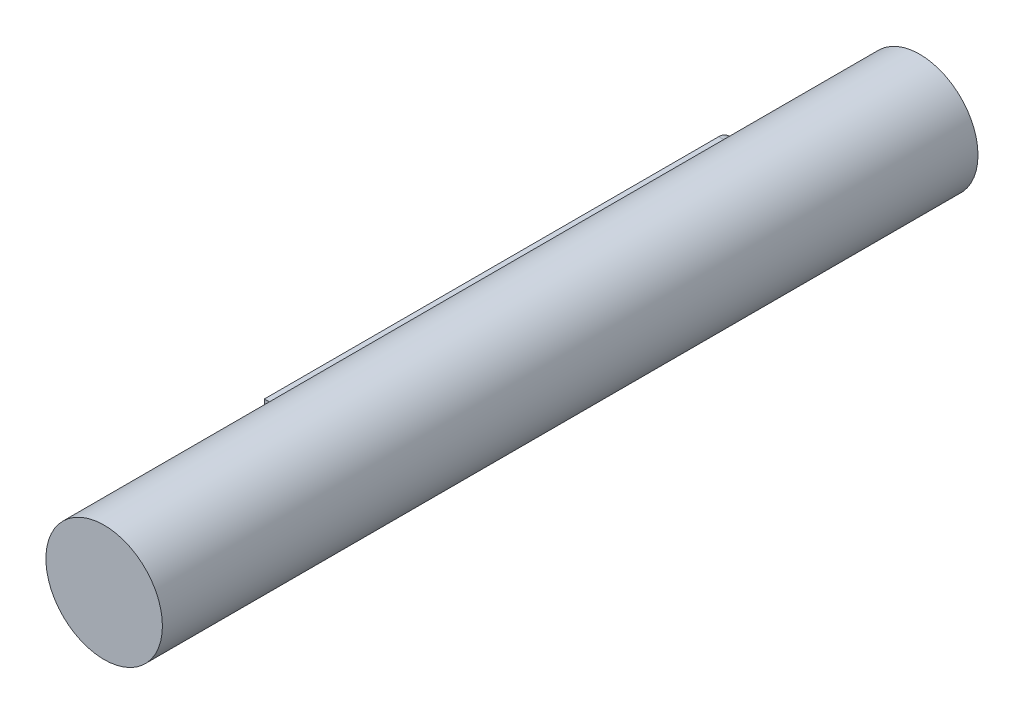
ISO-10303-21;
HEADER;
FILE_DESCRIPTION(('STEP AP214'),'2;1');
FILE_NAME('part.step','',(''),(''),'','','');
FILE_SCHEMA(('AUTOMOTIVE_DESIGN { 1 0 10303 214 1 1 1 1 }'));
ENDSEC;
DATA;
#1=APPLICATION_CONTEXT('core data for automotive mechanical design processes');
#2=APPLICATION_PROTOCOL_DEFINITION('international standard','automotive_design',2000,#1);
#3=PRODUCT_CONTEXT('',#1,'mechanical');
#4=PRODUCT('Part','Part','',(#3));
#5=PRODUCT_RELATED_PRODUCT_CATEGORY('part','',(#4));
#6=PRODUCT_DEFINITION_FORMATION('','',#4);
#7=PRODUCT_DEFINITION_CONTEXT('part definition',#1,'design');
#8=PRODUCT_DEFINITION('design','',#6,#7);
#9=PRODUCT_DEFINITION_SHAPE('','',#8);
#10=(LENGTH_UNIT() NAMED_UNIT(*) SI_UNIT(.MILLI.,.METRE.));
#11=(NAMED_UNIT(*) PLANE_ANGLE_UNIT() SI_UNIT($,.RADIAN.));
#12=(NAMED_UNIT(*) SI_UNIT($,.STERADIAN.) SOLID_ANGLE_UNIT());
#13=UNCERTAINTY_MEASURE_WITH_UNIT(LENGTH_MEASURE(1.E-05),#10,'distance_accuracy_value','');
#14=(GEOMETRIC_REPRESENTATION_CONTEXT(3) GLOBAL_UNCERTAINTY_ASSIGNED_CONTEXT((#13)) GLOBAL_UNIT_ASSIGNED_CONTEXT((#10,
#11,#12)) REPRESENTATION_CONTEXT('',''));
#15=CARTESIAN_POINT('',(0.,0.,0.));
#16=DIRECTION('',(0.,0.,1.));
#17=DIRECTION('',(1.,0.,0.));
#18=AXIS2_PLACEMENT_3D('',#15,#16,#17);
#19=CARTESIAN_POINT('',(-12.5,-2.5,140.));
#20=DIRECTION('',(0.,1.,0.));
#21=DIRECTION('',(-1.,0.,0.));
#22=AXIS2_PLACEMENT_3D('',#19,#20,#21);
#23=PLANE('',#22);
#24=DIRECTION('',(0.,0.,-1.));
#25=VECTOR('',#24,1.);
#26=CARTESIAN_POINT('',(-12.5,-2.5,140.));
#27=LINE('',#26,#25);
#28=CARTESIAN_POINT('',(-12.5,-2.5,100.));
#29=VERTEX_POINT('',#28);
#30=CARTESIAN_POINT('',(-12.5,-2.5,22.0001));
#31=VERTEX_POINT('',#30);
#32=EDGE_CURVE('E129',#29,#31,#27,.T.);
#33=ORIENTED_EDGE('',*,*,#32,.T.);
#34=CARTESIAN_POINT('',(-9.54158128379447,-2.5,22.0001));
#35=CARTESIAN_POINT('',(-9.86105418919632,-2.5,22.0001));
#36=CARTESIAN_POINT('',(-10.1805270945982,-2.5,22.0001));
#37=CARTESIAN_POINT('',(-11.213625693908,-2.5,22.0001));
#38=CARTESIAN_POINT('',(-11.927251387816,-2.5,22.0001));
#39=CARTESIAN_POINT('',(-12.6408770817241,-2.5,22.0001));
#40=(BOUNDED_CURVE() B_SPLINE_CURVE(3,(#34,#35,#36,#37,#38,#39),.UNSPECIFIED.,.F.,
.F.) B_SPLINE_CURVE_WITH_KNOTS((4,2,4),(-0.0126408770817244,-0.0116824583655189,
-0.00954158128379478),
.UNSPECIFIED.) CURVE() GEOMETRIC_REPRESENTATION_ITEM() RATIONAL_B_SPLINE_CURVE((1.,1.,1.,1.,1.,1.)) REPRESENTATION_ITEM(''));
#41=CARTESIAN_POINT('',(-9.68245836551855,-2.5,22.0001));
#42=VERTEX_POINT('',#41);
#43=EDGE_CURVE('E236',#31,#42,#40,.F.);
#44=ORIENTED_EDGE('',*,*,#43,.T.);
#45=DIRECTION('',(0.,0.,-1.));
#46=VECTOR('',#45,1.);
#47=CARTESIAN_POINT('',(-9.68245836551855,-2.5,140.));
#48=LINE('',#47,#46);
#49=CARTESIAN_POINT('',(-9.68245836551855,-2.5,100.));
#50=VERTEX_POINT('',#49);
#51=EDGE_CURVE('E132',#50,#42,#48,.T.);
#52=ORIENTED_EDGE('',*,*,#51,.F.);
#53=DIRECTION('',(1.,0.,0.));
#54=VECTOR('',#53,1.);
#55=CARTESIAN_POINT('',(-9.68245836551855,-2.5,100.));
#56=LINE('',#55,#54);
#57=EDGE_CURVE('E118',#29,#50,#56,.T.);
#58=ORIENTED_EDGE('',*,*,#57,.F.);
#59=EDGE_LOOP('',(#33,#44,#52,#58));
#60=FACE_BOUND('',#59,.T.);
#61=ADVANCED_FACE('F53',(#60),#23,.F.);
#62=CARTESIAN_POINT('',(-12.5,2.5,140.));
#63=DIRECTION('',(0.,-1.,0.));
#64=DIRECTION('',(0.,0.,-1.));
#65=AXIS2_PLACEMENT_3D('',#62,#63,#64);
#66=PLANE('',#65);
#67=DIRECTION('',(0.,0.,-1.));
#68=VECTOR('',#67,1.);
#69=CARTESIAN_POINT('',(-9.68245836551854,2.5,140.));
#70=LINE('',#69,#68);
#71=CARTESIAN_POINT('',(-9.68245836551855,2.5,100.));
#72=VERTEX_POINT('',#71);
#73=CARTESIAN_POINT('',(-9.68245836551854,2.5,22.0001));
#74=VERTEX_POINT('',#73);
#75=EDGE_CURVE('E146',#72,#74,#70,.T.);
#76=ORIENTED_EDGE('',*,*,#75,.T.);
#77=CARTESIAN_POINT('',(-12.6408770817241,2.5,22.0001));
#78=CARTESIAN_POINT('',(-11.927251387816,2.5,22.0001));
#79=CARTESIAN_POINT('',(-11.213625693908,2.5,22.0001));
#80=CARTESIAN_POINT('',(-10.1805270945982,2.5,22.0001));
#81=CARTESIAN_POINT('',(-9.86105418919631,2.5,22.0001));
#82=CARTESIAN_POINT('',(-9.54158128379447,2.5,22.0001));
#83=(BOUNDED_CURVE() B_SPLINE_CURVE(3,(#77,#78,#79,#80,#81,#82),.UNSPECIFIED.,.F.,
.F.) B_SPLINE_CURVE_WITH_KNOTS((4,2,4),(0.00954158128379479,0.0116824583655189,
0.0126408770817244),
.UNSPECIFIED.) CURVE() GEOMETRIC_REPRESENTATION_ITEM() RATIONAL_B_SPLINE_CURVE((1.,1.,1.,1.,1.,1.)) REPRESENTATION_ITEM(''));
#84=CARTESIAN_POINT('',(-12.5,2.5,22.0001));
#85=VERTEX_POINT('',#84);
#86=EDGE_CURVE('E80',#74,#85,#83,.F.);
#87=ORIENTED_EDGE('',*,*,#86,.T.);
#88=DIRECTION('',(0.,0.,-1.));
#89=VECTOR('',#88,1.);
#90=CARTESIAN_POINT('',(-12.5,2.5,140.));
#91=LINE('',#90,#89);
#92=CARTESIAN_POINT('',(-12.5,2.5,100.));
#93=VERTEX_POINT('',#92);
#94=EDGE_CURVE('E141',#93,#85,#91,.T.);
#95=ORIENTED_EDGE('',*,*,#94,.F.);
#96=DIRECTION('',(-1.,0.,0.));
#97=VECTOR('',#96,1.);
#98=CARTESIAN_POINT('',(-9.68245836551855,2.5,100.));
#99=LINE('',#98,#97);
#100=EDGE_CURVE('E121',#72,#93,#99,.T.);
#101=ORIENTED_EDGE('',*,*,#100,.F.);
#102=EDGE_LOOP('',(#76,#87,#95,#101));
#103=FACE_BOUND('',#102,.T.);
#104=ADVANCED_FACE('F173',(#103),#66,.F.);
#105=CARTESIAN_POINT('',(-12.5,-2.5,140.));
#106=DIRECTION('',(1.,0.,0.));
#107=DIRECTION('',(0.,0.,-1.));
#108=AXIS2_PLACEMENT_3D('',#105,#106,#107);
#109=PLANE('',#108);
#110=ORIENTED_EDGE('',*,*,#94,.T.);
#111=CARTESIAN_POINT('',(-12.5,-2.75,22.0001));
#112=CARTESIAN_POINT('',(-12.5,-2.,22.0001));
#113=CARTESIAN_POINT('',(-12.5,-1.25,22.0001));
#114=CARTESIAN_POINT('',(-12.5,-0.166666666666665,22.0001));
#115=CARTESIAN_POINT('',(-12.5,0.166666666666668,22.0001));
#116=CARTESIAN_POINT('',(-12.5,1.25,22.0001));
#117=CARTESIAN_POINT('',(-12.5,2.,22.0001));
#118=CARTESIAN_POINT('',(-12.5,2.75,22.0001));
#119=(BOUNDED_CURVE() B_SPLINE_CURVE(3,(#111,#112,#113,#114,#115,#116,#117,#118),.UNSPECIFIED.,
.F.,.F.) B_SPLINE_CURVE_WITH_KNOTS((4,2,2,4),(-0.00275,-0.0005,0.000499999999999999,0.00275),
.UNSPECIFIED.) CURVE() GEOMETRIC_REPRESENTATION_ITEM() RATIONAL_B_SPLINE_CURVE((1.,1.,1.,1.,1.,
1.,1.,1.)) REPRESENTATION_ITEM(''));
#120=EDGE_CURVE('E138',#85,#31,#119,.F.);
#121=ORIENTED_EDGE('',*,*,#120,.T.);
#122=ORIENTED_EDGE('',*,*,#32,.F.);
#123=DIRECTION('',(0.,-1.,0.));
#124=VECTOR('',#123,1.);
#125=CARTESIAN_POINT('',(-12.5,2.5,100.));
#126=LINE('',#125,#124);
#127=EDGE_CURVE('E115',#93,#29,#126,.T.);
#128=ORIENTED_EDGE('',*,*,#127,.F.);
#129=EDGE_LOOP('',(#110,#121,#122,#128));
#130=FACE_BOUND('',#129,.T.);
#131=ADVANCED_FACE('F136',(#130),#109,.F.);
#132=CARTESIAN_POINT('',(0.,0.,140.));
#133=DIRECTION('',(0.,0.,-1.));
#134=DIRECTION('',(-1.,0.,0.));
#135=AXIS2_PLACEMENT_3D('',#132,#133,#134);
#136=CYLINDRICAL_SURFACE('',#135,10.);
#137=ORIENTED_EDGE('',*,*,#75,.F.);
#138=CARTESIAN_POINT('',(0.,0.,100.));
#139=DIRECTION('',(0.,0.,-1.));
#140=DIRECTION('',(1.,0.,0.));
#141=AXIS2_PLACEMENT_3D('',#138,#139,#140);
#142=CIRCLE('',#141,10.);
#143=EDGE_CURVE('E134',#50,#72,#142,.T.);
#144=ORIENTED_EDGE('',*,*,#143,.F.);
#145=ORIENTED_EDGE('',*,*,#51,.T.);
#146=CARTESIAN_POINT('',(-9.9874921777191,-0.499999999999999,20.0001));
#147=CARTESIAN_POINT('',(-9.98492357502207,-0.551183505955471,20.0001056410229));
#148=CARTESIAN_POINT('',(-9.98193356320358,-0.602362675127145,20.001083027323));
#149=CARTESIAN_POINT('',(-9.97503529637868,-0.706579947574355,20.0053240990309));
#150=CARTESIAN_POINT('',(-9.97109566077099,-0.759612339914603,20.0086758409831));
#151=CARTESIAN_POINT('',(-9.96454582956608,-0.839567472977696,20.0157654567261));
#152=CARTESIAN_POINT('',(-9.96222502745392,-0.866602789285128,20.0185167596407));
#153=CARTESIAN_POINT('',(-9.95734895790728,-0.920934242525226,20.0248081867703));
#154=CARTESIAN_POINT('',(-9.9547909465647,-0.948228968998694,20.0283584652716));
#155=CARTESIAN_POINT('',(-9.94944037954686,-1.00300581598472,20.0363212762163));
#156=CARTESIAN_POINT('',(-9.94664538718713,-1.03048628032519,20.0407436018855));
#157=CARTESIAN_POINT('',(-9.94082068277931,-1.08555930960506,20.0505269818495));
#158=CARTESIAN_POINT('',(-9.93778879578896,-1.11314997253359,20.0558974943934));
#159=CARTESIAN_POINT('',(-9.93148917501651,-1.16836507372058,20.0676559700844));
#160=CARTESIAN_POINT('',(-9.9282194714646,-1.19598733492754,20.0740531289791));
#161=CARTESIAN_POINT('',(-9.92144728694388,-1.25118639233286,20.0879465868891));
#162=CARTESIAN_POINT('',(-9.91794302676574,-1.27876069767844,20.0954519728144));
#163=CARTESIAN_POINT('',(-9.91173226145924,-1.32586429133197,20.1093154085953));
#164=CARTESIAN_POINT('',(-9.90907781056222,-1.34547996433546,20.1154044761895));
#165=CARTESIAN_POINT('',(-9.90323575891121,-1.38770748895587,20.1292315621051));
#166=CARTESIAN_POINT('',(-9.90003218644179,-1.41028241041613,20.1370761636331));
#167=CARTESIAN_POINT('',(-9.89309172625997,-1.45811642255427,20.1547219504185));
#168=CARTESIAN_POINT('',(-9.88934099302549,-1.48332885051111,20.1646444169374));
#169=CARTESIAN_POINT('',(-9.88130300199088,-1.53608058804625,20.1868064969104));
#170=CARTESIAN_POINT('',(-9.8770029436917,-1.56356161718994,20.1991812315791));
#171=CARTESIAN_POINT('',(-9.870309261534,-1.60523599690796,20.2193120536524));
#172=CARTESIAN_POINT('',(-9.86795533764746,-1.619687064027,20.2265519040296));
#173=CARTESIAN_POINT('',(-9.86310964548691,-1.64900286682381,20.2417878236754));
#174=CARTESIAN_POINT('',(-9.86061640844938,-1.66385734592626,20.2498032141109));
#175=CARTESIAN_POINT('',(-9.85546629409651,-1.69413144878273,20.266768425334));
#176=CARTESIAN_POINT('',(-9.8528081250332,-1.70953563217538,20.275745453049));
#177=CARTESIAN_POINT('',(-9.84763760042937,-1.73913008905865,20.2936858072299));
#178=CARTESIAN_POINT('',(-9.84512581287481,-1.75333865518725,20.3026192063198));
#179=CARTESIAN_POINT('',(-9.83802637859361,-1.79300494742153,20.3284925647517));
#180=CARTESIAN_POINT('',(-9.83342952061639,-1.81810915721673,20.3459778583146));
#181=CARTESIAN_POINT('',(-9.82481402287985,-1.86412408047478,20.3802249494684));
#182=CARTESIAN_POINT('',(-9.82079441621375,-1.88516860108071,20.3968072796872));
#183=CARTESIAN_POINT('',(-9.81333469041476,-1.92350017428522,20.4287960970897));
#184=CARTESIAN_POINT('',(-9.8098901282229,-1.94090892422563,20.4440556584759));
#185=CARTESIAN_POINT('',(-9.80358752709996,-1.97234753976742,20.4730051842871));
#186=CARTESIAN_POINT('',(-9.80072068476531,-1.98648559810226,20.4865760939837));
#187=CARTESIAN_POINT('',(-9.79372940651825,-2.02069817433312,20.5208124256131));
#188=CARTESIAN_POINT('',(-9.78964645133872,-2.04044349561703,20.541817352336));
#189=CARTESIAN_POINT('',(-9.78172305112722,-2.0782566151617,20.5845794960078));
#190=CARTESIAN_POINT('',(-9.77787941165725,-2.09634981466548,20.6063137111583));
#191=CARTESIAN_POINT('',(-9.77043861587688,-2.13094672512372,20.6504475702414));
#192=CARTESIAN_POINT('',(-9.76683837984376,-2.14747223114814,20.6728296168054));
#193=CARTESIAN_POINT('',(-9.7598830492511,-2.17901728127967,20.7181734336649));
#194=CARTESIAN_POINT('',(-9.75652513634276,-2.19405533891931,20.7411219098127));
#195=CARTESIAN_POINT('',(-9.75005442960086,-2.22270741140073,20.7875164558557));
#196=CARTESIAN_POINT('',(-9.74693906645117,-2.23633707241771,20.8109525191282));
#197=CARTESIAN_POINT('',(-9.74095310279163,-2.26225172972008,20.8582428669223));
#198=CARTESIAN_POINT('',(-9.73808016352248,-2.27455000652955,20.8820895909216));
#199=CARTESIAN_POINT('',(-9.73257876148505,-2.29787888529219,20.9301246249363));
#200=CARTESIAN_POINT('',(-9.72994814453865,-2.30892091617732,20.9543071488201));
#201=CARTESIAN_POINT('',(-9.72493134597715,-2.32981185866372,21.0029396819767));
#202=CARTESIAN_POINT('',(-9.72254313422412,-2.33967083250647,21.0273851690662));
#203=CARTESIAN_POINT('',(-9.7180103907684,-2.35826781207661,21.0764718160761));
#204=CARTESIAN_POINT('',(-9.71586389514456,-2.3670149398938,21.1011093470959));
#205=CARTESIAN_POINT('',(-9.71181679555187,-2.38345813795292,21.1505107617006));
#206=CARTESIAN_POINT('',(-9.70991420258953,-2.39116274293037,21.175271648617));
#207=CARTESIAN_POINT('',(-9.7063968200825,-2.40538488204343,21.2241525208998));
#208=CARTESIAN_POINT('',(-9.70477397621743,-2.41193583318468,21.2482622387575));
#209=CARTESIAN_POINT('',(-9.70169482803041,-2.4243205858148,21.2970715946335));
#210=CARTESIAN_POINT('',(-9.70024146902898,-2.43014180766375,21.3217746025576));
#211=CARTESIAN_POINT('',(-9.69750332687481,-2.44107679310964,21.3717617007739));
#212=CARTESIAN_POINT('',(-9.6962216190985,-2.44617772178235,21.397048758453));
#213=CARTESIAN_POINT('',(-9.69382610633718,-2.45568155786867,21.4481950890331));
#214=CARTESIAN_POINT('',(-9.69271543118267,-2.46007151597084,21.4740569059374));
#215=CARTESIAN_POINT('',(-9.69066206964566,-2.46816282014316,21.5263440675197));
#216=CARTESIAN_POINT('',(-9.68972255100551,-2.47185122797257,21.5527715319501));
#217=CARTESIAN_POINT('',(-9.68801150838121,-2.47854813309395,21.6061809348616));
#218=CARTESIAN_POINT('',(-9.68724316345736,-2.48154379800564,21.633164571367));
#219=CARTESIAN_POINT('',(-9.68517172696764,-2.48959670926804,21.7156508175322));
#220=CARTESIAN_POINT('',(-9.68415712212834,-2.49350464227972,21.7712739479169));
#221=CARTESIAN_POINT('',(-9.68278880189356,-2.49875005086904,21.8846373905148));
#222=CARTESIAN_POINT('',(-9.68245989061904,-2.49999110197927,21.9423826035269));
#223=CARTESIAN_POINT('',(-9.68245836551855,-2.5,22.0001));
#224=B_SPLINE_CURVE_WITH_KNOTS('',3,(#146,#147,#148,#149,#150,#151,#152,#153,#154,#155,#156,
#157,#158,#159,#160,#161,#162,#163,#164,#165,#166,#167,#168,#169,#170,#171,#172,#173,#174,#175,
#176,#177,#178,#179,#180,#181,#182,#183,#184,#185,#186,#187,#188,#189,#190,#191,#192,#193,#194,
#195,#196,#197,#198,#199,#200,#201,#202,#203,#204,#205,#206,#207,#208,#209,#210,#211,#212,#213,
#214,#215,#216,#217,#218,#219,#220,#221,#222,#223),.UNSPECIFIED.,.F.,.F.,(4,2,2,2,2,2,2,2,2,2,2,
2,2,2,2,2,2,2,2,2,2,2,2,2,2,2,2,2,2,2,2,2,2,2,2,2,2,2,4),(0.,0.15376110872704,0.313545165421078,
0.395357166786429,0.478274388577347,0.562182074380572,0.646979640248714,0.732584140717607,
0.818934144961492,0.881054958048401,0.95337658502054,1.03541045651588,1.12669662054863,
1.17569179790827,1.22686995935341,1.28093747118853,1.33184165462503,1.42458834127313,
1.50582604796818,1.57601217066002,1.63541485583021,1.72270636223254,1.80827657550749,
1.89239185807975,1.97527502168491,2.05710665696803,2.13802728564283,2.21814013247422,
2.29751431075845,2.37618823242344,2.45417308403357,2.52926705728365,2.60551599933935,
2.68298708759836,2.76174031365327,2.84182887904401,2.92329960636211,3.09053096619248,
3.26371361526828),.UNSPECIFIED.);
#225=CARTESIAN_POINT('',(-9.98749217771908,-0.500000000000003,20.0001));
#226=VERTEX_POINT('',#225);
#227=EDGE_CURVE('E67',#42,#226,#224,.F.);
#228=ORIENTED_EDGE('',*,*,#227,.T.);
#229=CARTESIAN_POINT('',(3.15719672627779E-13,0.,20.0001));
#230=DIRECTION('',(0.,0.,1.));
#231=DIRECTION('',(-1.,0.,0.));
#232=AXIS2_PLACEMENT_3D('',#229,#230,#231);
#233=CIRCLE('',#232,10.0000000000003);
#234=CARTESIAN_POINT('',(-9.98749217771908,0.499999999999999,20.0001));
#235=VERTEX_POINT('',#234);
#236=EDGE_CURVE('E125',#235,#226,#233,.T.);
#237=ORIENTED_EDGE('',*,*,#236,.F.);
#238=CARTESIAN_POINT('',(-9.68245836551854,2.5,22.0001));
#239=CARTESIAN_POINT('',(-9.68245995301419,2.49999067221102,21.9416895804259));
#240=CARTESIAN_POINT('',(-9.6827970148072,2.49871983165885,21.8832499445812));
#241=CARTESIAN_POINT('',(-9.68419975311338,2.49334411282292,21.7685435771413));
#242=CARTESIAN_POINT('',(-9.68523978158278,2.48933894754351,21.7122717105183));
#243=CARTESIAN_POINT('',(-9.68736348751592,2.48108217022253,21.6288359395766));
#244=CARTESIAN_POINT('',(-9.68815114852842,2.47801071194662,21.6015466323402));
#245=CARTESIAN_POINT('',(-9.68990523949396,2.47114352177002,21.5475387616341));
#246=CARTESIAN_POINT('',(-9.69086838311925,2.46736106927935,21.520818416454));
#247=CARTESIAN_POINT('',(-9.69297340769375,2.45906250371554,21.4679588831259));
#248=CARTESIAN_POINT('',(-9.69411201578936,2.45455977647792,21.441817470435));
#249=CARTESIAN_POINT('',(-9.6965678019547,2.44481073172039,21.3901258461151));
#250=CARTESIAN_POINT('',(-9.69788174911169,2.43957780413946,21.364572965013));
#251=CARTESIAN_POINT('',(-9.70068878736199,2.42835866833492,21.314068643021));
#252=CARTESIAN_POINT('',(-9.70217870782368,2.42238571884758,21.2891140898089));
#253=CARTESIAN_POINT('',(-9.70533533737326,2.40967686710321,21.2398165491906));
#254=CARTESIAN_POINT('',(-9.70699901531859,2.40295394054561,21.2154700313016));
#255=CARTESIAN_POINT('',(-9.71057465012866,2.38847951392781,21.1665329344088));
#256=CARTESIAN_POINT('',(-9.71249115434776,2.38070909761191,21.1419482645943));
#257=CARTESIAN_POINT('',(-9.71656529479932,2.36413502718561,21.0928893362242));
#258=CARTESIAN_POINT('',(-9.71872503284946,2.35532232768677,21.0684183004668));
#259=CARTESIAN_POINT('',(-9.72328346658457,2.33659448226043,21.0196551831176));
#260=CARTESIAN_POINT('',(-9.72568423256213,2.32666968153123,20.9953669942165));
#261=CARTESIAN_POINT('',(-9.7307253556619,2.30564684228225,20.9470400888959));
#262=CARTESIAN_POINT('',(-9.73336784405572,2.29453818880534,20.9230062022995));
#263=CARTESIAN_POINT('',(-9.73889221024994,2.27107526148361,20.8752600073705));
#264=CARTESIAN_POINT('',(-9.74177633646164,2.25870898929272,20.8515538436037));
#265=CARTESIAN_POINT('',(-9.74778390123056,2.2326569333752,20.804536743931));
#266=CARTESIAN_POINT('',(-9.75090976431127,2.21895728794762,20.7812337849631));
#267=CARTESIAN_POINT('',(-9.75740071527214,2.19016319140687,20.7350981726512));
#268=CARTESIAN_POINT('',(-9.76076844771936,2.17505250825405,20.7122760073353));
#269=CARTESIAN_POINT('',(-9.76774264311571,2.14335945035251,20.667178162131));
#270=CARTESIAN_POINT('',(-9.77135198576211,2.12675798074822,20.6449163285786));
#271=CARTESIAN_POINT('',(-9.77881035159824,2.09200566298744,20.6010169253301));
#272=CARTESIAN_POINT('',(-9.78266250218236,2.07383245566885,20.5793975805313));
#273=CARTESIAN_POINT('',(-9.79060184822871,2.03585495784617,20.5368598428135));
#274=CARTESIAN_POINT('',(-9.7946922551635,2.0160247298424,20.5159651527527));
#275=CARTESIAN_POINT('',(-9.80165903039588,1.98185078492125,20.4820904573797));
#276=CARTESIAN_POINT('',(-9.80449348678477,1.96784118531499,20.4687625836479));
#277=CARTESIAN_POINT('',(-9.81075311397253,1.93655052603634,20.4401900856008));
#278=CARTESIAN_POINT('',(-9.81418716253491,1.91915800773329,20.4250690854636));
#279=CARTESIAN_POINT('',(-9.82164774368189,1.88073694775589,20.3932604421141));
#280=CARTESIAN_POINT('',(-9.82567849039216,1.85958218272344,20.3767263123285));
#281=CARTESIAN_POINT('',(-9.83433848239353,1.81320662488166,20.3424954781765));
#282=CARTESIAN_POINT('',(-9.83896828742895,1.78784643289566,20.3249871711075));
#283=CARTESIAN_POINT('',(-9.84612400413001,1.7477335640621,20.2990662135495));
#284=CARTESIAN_POINT('',(-9.84866040778961,1.73333539000887,20.2901018318005));
#285=CARTESIAN_POINT('',(-9.8538857463452,1.70331677044816,20.2720894280401));
#286=CARTESIAN_POINT('',(-9.85657401864965,1.6876772026558,20.26307299016));
#287=CARTESIAN_POINT('',(-9.86173606027397,1.65720782170343,20.2461908220589));
#288=CARTESIAN_POINT('',(-9.86421162013859,1.64239840325199,20.2382887595243));
#289=CARTESIAN_POINT('',(-9.86902582615895,1.6131544303745,20.223257468623));
#290=CARTESIAN_POINT('',(-9.87136591193587,1.59872955841976,20.216109814384));
#291=CARTESIAN_POINT('',(-9.87803054908341,1.5570652389975,20.1962027783997));
#292=CARTESIAN_POINT('',(-9.8823144242986,1.52957146437007,20.1839580092233));
#293=CARTESIAN_POINT('',(-9.89033564544092,1.47669738981005,20.1619900504129));
#294=CARTESIAN_POINT('',(-9.89408555623986,1.4513723679297,20.1521374094707));
#295=CARTESIAN_POINT('',(-9.90103986076694,1.40320347432097,20.1345788163852));
#296=CARTESIAN_POINT('',(-9.90425788189039,1.38040403756179,20.1267561338424));
#297=CARTESIAN_POINT('',(-9.91014449438945,1.33760834979883,20.1129304704056));
#298=CARTESIAN_POINT('',(-9.91282877643284,1.31764744227893,20.1068242474691));
#299=CARTESIAN_POINT('',(-9.91900373689673,1.27049815364529,20.0931650527944));
#300=CARTESIAN_POINT('',(-9.92244671419822,1.24323238494097,20.0858566704144));
#301=CARTESIAN_POINT('',(-9.92910150920754,1.18865382791971,20.0723229001527));
#302=CARTESIAN_POINT('',(-9.93231502795016,1.16134336494703,20.0660889184363));
#303=CARTESIAN_POINT('',(-9.93850775265456,1.10675197700646,20.0546259748177));
#304=CARTESIAN_POINT('',(-9.94148884162552,1.07947309002147,20.0493882978136));
#305=CARTESIAN_POINT('',(-9.94721735080835,1.02502040875895,20.0398430416213));
#306=CARTESIAN_POINT('',(-9.94996685137887,0.997848399204784,20.0355264865819));
#307=CARTESIAN_POINT('',(-9.9552318591427,0.943682128850655,20.0277508107415));
#308=CARTESIAN_POINT('',(-9.95774969646995,0.916689424863563,20.024282387737));
#309=CARTESIAN_POINT('',(-9.96255086724232,0.862952672206578,20.0181332336932));
#310=CARTESIAN_POINT('',(-9.96483682322486,0.836209951448363,20.0154428508789));
#311=CARTESIAN_POINT('',(-9.97129238745342,0.75709032452605,20.0085054267008));
#312=CARTESIAN_POINT('',(-9.97517783949446,0.704604303905164,20.005222868257));
#313=CARTESIAN_POINT('',(-9.98199057332699,0.601410098294656,20.0010648033941));
#314=CARTESIAN_POINT('',(-9.98494777232556,0.550707315380325,20.000105425642));
#315=CARTESIAN_POINT('',(-9.98749217771909,0.500000000000001,20.0001));
#316=B_SPLINE_CURVE_WITH_KNOTS('',3,(#238,#239,#240,#241,#242,#243,#244,#245,#246,#247,#248,
#249,#250,#251,#252,#253,#254,#255,#256,#257,#258,#259,#260,#261,#262,#263,#264,#265,#266,#267,
#268,#269,#270,#271,#272,#273,#274,#275,#276,#277,#278,#279,#280,#281,#282,#283,#284,#285,#286,
#287,#288,#289,#290,#291,#292,#293,#294,#295,#296,#297,#298,#299,#300,#301,#302,#303,#304,#305,
#306,#307,#308,#309,#310,#311,#312,#313,#314,#315),.UNSPECIFIED.,.F.,.F.,(4,2,2,2,2,2,2,2,2,2,2,
2,2,2,2,2,2,2,2,2,2,2,2,2,2,2,2,2,2,2,2,2,2,2,2,2,2,2,4),(0.,0.175263441820136,
0.344454737287259,0.42686289238418,0.507862245047018,0.587501488190768,0.665836077105355,
0.742928670005996,0.818849551227331,0.89639346041573,0.974667991248671,1.05368419730902,
1.13348045045472,1.21412593748377,1.29572408862992,1.37841577822081,1.46238210790163,
1.54784656583635,1.63507635954391,1.69369156092184,1.76356676634736,1.84497832383757,
1.93840151252523,1.98984210964407,2.04458547654908,2.09547926948946,2.14427691435433,
2.23543362727945,2.31770314620818,2.39064005589421,2.45376860616626,2.53905762076371,
2.62362910964718,2.70742286724148,2.79035848918509,2.87233897582723,2.95325395791332,
3.11138388020935,3.26371380919115),.UNSPECIFIED.);
#317=EDGE_CURVE('E13',#235,#74,#316,.F.);
#318=ORIENTED_EDGE('',*,*,#317,.T.);
#319=EDGE_LOOP('',(#137,#144,#145,#228,#237,#318));
#320=FACE_BOUND('',#319,.T.);
#321=CARTESIAN_POINT('',(0.,0.,0.));
#322=DIRECTION('',(0.,0.,1.));
#323=DIRECTION('',(1.,0.,0.));
#324=AXIS2_PLACEMENT_3D('',#321,#322,#323);
#325=CIRCLE('',#324,10.);
#326=CARTESIAN_POINT('',(10.,0.,0.));
#327=VERTEX_POINT('',#326);
#328=EDGE_CURVE('E149',#327,#327,#325,.T.);
#329=ORIENTED_EDGE('',*,*,#328,.T.);
#330=EDGE_LOOP('',(#329));
#331=FACE_BOUND('',#330,.T.);
#332=CARTESIAN_POINT('',(0.,0.,140.));
#333=DIRECTION('',(0.,0.,1.));
#334=DIRECTION('',(1.,0.,0.));
#335=AXIS2_PLACEMENT_3D('',#332,#333,#334);
#336=CIRCLE('',#335,10.);
#337=CARTESIAN_POINT('',(10.,0.,140.));
#338=VERTEX_POINT('',#337);
#339=EDGE_CURVE('E142',#338,#338,#336,.T.);
#340=ORIENTED_EDGE('',*,*,#339,.F.);
#341=EDGE_LOOP('',(#340));
#342=FACE_BOUND('',#341,.T.);
#343=ADVANCED_FACE('F185',(#320,#331,#342),#136,.T.);
#344=CARTESIAN_POINT('',(0.,0.,140.));
#345=DIRECTION('',(0.,0.,1.));
#346=DIRECTION('',(1.,0.,0.));
#347=AXIS2_PLACEMENT_3D('',#344,#345,#346);
#348=PLANE('',#347);
#349=ORIENTED_EDGE('',*,*,#339,.T.);
#350=EDGE_LOOP('',(#349));
#351=FACE_BOUND('',#350,.T.);
#352=ADVANCED_FACE('F188',(#351),#348,.T.);
#353=CARTESIAN_POINT('',(0.,0.,0.));
#354=DIRECTION('',(0.,0.,1.));
#355=DIRECTION('',(1.,0.,0.));
#356=AXIS2_PLACEMENT_3D('',#353,#354,#355);
#357=PLANE('',#356);
#358=ORIENTED_EDGE('',*,*,#328,.F.);
#359=EDGE_LOOP('',(#358));
#360=FACE_BOUND('',#359,.T.);
#361=ADVANCED_FACE('F384',(#360),#357,.F.);
#362=CARTESIAN_POINT('',(0.,0.,100.));
#363=DIRECTION('',(0.,0.,1.));
#364=DIRECTION('',(1.,0.,0.));
#365=AXIS2_PLACEMENT_3D('',#362,#363,#364);
#366=PLANE('',#365);
#367=ORIENTED_EDGE('',*,*,#127,.T.);
#368=ORIENTED_EDGE('',*,*,#57,.T.);
#369=ORIENTED_EDGE('',*,*,#143,.T.);
#370=ORIENTED_EDGE('',*,*,#100,.T.);
#371=EDGE_LOOP('',(#367,#368,#369,#370));
#372=FACE_BOUND('',#371,.T.);
#373=ADVANCED_FACE('F117',(#372),#366,.T.);
#374=CARTESIAN_POINT('',(3.15719672627779E-13,0.,20.0001));
#375=DIRECTION('',(0.,0.,-1.));
#376=DIRECTION('',(-1.,0.,0.));
#377=AXIS2_PLACEMENT_3D('',#374,#375,#376);
#378=PLANE('',#377);
#379=ORIENTED_EDGE('',*,*,#236,.T.);
#380=CARTESIAN_POINT('',(-12.6408770817241,-0.499999999999999,20.0001));
#381=CARTESIAN_POINT('',(-11.927251387816,-0.499999999999999,20.0001));
#382=CARTESIAN_POINT('',(-11.213625693908,-0.499999999999999,20.0001));
#383=CARTESIAN_POINT('',(-10.1805270945982,-0.499999999999999,20.0001));
#384=CARTESIAN_POINT('',(-9.86105418919632,-0.499999999999999,20.0001));
#385=CARTESIAN_POINT('',(-9.54158128379447,-0.499999999999999,20.0001));
#386=(BOUNDED_CURVE() B_SPLINE_CURVE(3,(#380,#381,#382,#383,#384,#385),.UNSPECIFIED.,.F.,
.F.) B_SPLINE_CURVE_WITH_KNOTS((4,2,4),(-0.0126408770817244,-0.0105000000000003,
-0.00954158128379478),
.UNSPECIFIED.) CURVE() GEOMETRIC_REPRESENTATION_ITEM() RATIONAL_B_SPLINE_CURVE((1.,1.,1.,1.,1.,1.)) REPRESENTATION_ITEM(''));
#387=CARTESIAN_POINT('',(-10.5,-0.499999999999999,20.0001));
#388=VERTEX_POINT('',#387);
#389=EDGE_CURVE('E222',#226,#388,#386,.F.);
#390=ORIENTED_EDGE('',*,*,#389,.T.);
#391=CARTESIAN_POINT('',(-10.5,2.75,20.0001));
#392=CARTESIAN_POINT('',(-10.5,2.,20.0001));
#393=CARTESIAN_POINT('',(-10.5,1.25,20.0001));
#394=CARTESIAN_POINT('',(-10.5,0.166666666666668,20.0001));
#395=CARTESIAN_POINT('',(-10.5,-0.166666666666665,20.0001));
#396=CARTESIAN_POINT('',(-10.5,-1.25,20.0001));
#397=CARTESIAN_POINT('',(-10.5,-2.,20.0001));
#398=CARTESIAN_POINT('',(-10.5,-2.75,20.0001));
#399=(BOUNDED_CURVE() B_SPLINE_CURVE(3,(#391,#392,#393,#394,#395,#396,#397,#398),.UNSPECIFIED.,
.F.,.F.) B_SPLINE_CURVE_WITH_KNOTS((4,2,2,4),(-0.00275,-0.000500000000000003,
0.000499999999999997,0.00275),
.UNSPECIFIED.) CURVE() GEOMETRIC_REPRESENTATION_ITEM() RATIONAL_B_SPLINE_CURVE((1.,1.,1.,1.,1.,
1.,1.,1.)) REPRESENTATION_ITEM(''));
#400=CARTESIAN_POINT('',(-10.5,0.500000000000001,20.0001));
#401=VERTEX_POINT('',#400);
#402=EDGE_CURVE('E322',#388,#401,#399,.F.);
#403=ORIENTED_EDGE('',*,*,#402,.T.);
#404=CARTESIAN_POINT('',(-9.54158128379447,0.500000000000001,20.0001));
#405=CARTESIAN_POINT('',(-9.86105418919631,0.500000000000001,20.0001));
#406=CARTESIAN_POINT('',(-10.1805270945982,0.500000000000001,20.0001));
#407=CARTESIAN_POINT('',(-11.213625693908,0.500000000000001,20.0001));
#408=CARTESIAN_POINT('',(-11.927251387816,0.500000000000001,20.0001));
#409=CARTESIAN_POINT('',(-12.6408770817241,0.500000000000001,20.0001));
#410=(BOUNDED_CURVE() B_SPLINE_CURVE(3,(#404,#405,#406,#407,#408,#409),.UNSPECIFIED.,.F.,
.F.) B_SPLINE_CURVE_WITH_KNOTS((4,2,4),(0.00954158128379479,0.0105000000000003,
0.0126408770817244),
.UNSPECIFIED.) CURVE() GEOMETRIC_REPRESENTATION_ITEM() RATIONAL_B_SPLINE_CURVE((1.,1.,1.,1.,1.,1.)) REPRESENTATION_ITEM(''));
#411=EDGE_CURVE('E225',#401,#235,#410,.F.);
#412=ORIENTED_EDGE('',*,*,#411,.T.);
#413=EDGE_LOOP('',(#379,#390,#403,#412));
#414=FACE_BOUND('',#413,.T.);
#415=ADVANCED_FACE('F221',(#414),#378,.T.);
#416=CARTESIAN_POINT('',(-9.54158128379447,2.5,22.0001));
#417=CARTESIAN_POINT('',(-9.86105418919631,2.5,22.0001));
#418=CARTESIAN_POINT('',(-10.1805270945982,2.5,22.0001));
#419=CARTESIAN_POINT('',(-11.213625693908,2.5,22.0001));
#420=CARTESIAN_POINT('',(-11.927251387816,2.5,22.0001));
#421=CARTESIAN_POINT('',(-12.6408770817241,2.5,22.0001));
#422=CARTESIAN_POINT('',(-9.54158128379447,2.5,20.0001));
#423=CARTESIAN_POINT('',(-9.86105418919631,2.5,20.0001));
#424=CARTESIAN_POINT('',(-10.1805270945982,2.5,20.0001));
#425=CARTESIAN_POINT('',(-11.213625693908,2.5,20.0001));
#426=CARTESIAN_POINT('',(-11.927251387816,2.5,20.0001));
#427=CARTESIAN_POINT('',(-12.6408770817241,2.5,20.0001));
#428=CARTESIAN_POINT('',(-9.54158128379447,0.500000000000001,20.0001));
#429=CARTESIAN_POINT('',(-9.86105418919631,0.500000000000001,20.0001));
#430=CARTESIAN_POINT('',(-10.1805270945982,0.500000000000001,20.0001));
#431=CARTESIAN_POINT('',(-11.213625693908,0.500000000000001,20.0001));
#432=CARTESIAN_POINT('',(-11.927251387816,0.500000000000001,20.0001));
#433=CARTESIAN_POINT('',(-12.6408770817241,0.500000000000001,20.0001));
#434=(BOUNDED_SURFACE() B_SPLINE_SURFACE(2,3,((#416,#417,#418,#419,#420,#421),(#422,#423,#424,
#425,#426,#427),(#428,#429,#430,#431,#432,#433)),.UNSPECIFIED.,.F.,.F.,
.F.) B_SPLINE_SURFACE_WITH_KNOTS((3,3),(4,2,4),(0.,1.),(0.00954158128379479,0.0105000000000003,
0.0126408770817244),
.UNSPECIFIED.) GEOMETRIC_REPRESENTATION_ITEM() RATIONAL_B_SPLINE_SURFACE(((1.,1.,1.,1.,1.,1.),
(1.,1.,1.,1.,1.,1.),(1.,1.,1.,1.,1.,1.))) REPRESENTATION_ITEM('') SURFACE());
#435=CARTESIAN_POINT('',(-12.5,2.5,22.0001));
#436=CARTESIAN_POINT('',(-12.4999989287419,2.49999892874189,21.959075173434));
#437=CARTESIAN_POINT('',(-12.4993687762716,2.4993687762719,21.9180414126242));
#438=CARTESIAN_POINT('',(-12.496764169934,2.49676416993544,21.837280196936));
#439=CARTESIAN_POINT('',(-12.4948301305019,2.49483013050417,21.7975500853533));
#440=CARTESIAN_POINT('',(-12.4896194257823,2.48961942578681,21.7193932060897));
#441=CARTESIAN_POINT('',(-12.4863821793083,2.48638217931412,21.6809612911916));
#442=CARTESIAN_POINT('',(-12.4785661366303,2.47856613663928,21.6054057688099));
#443=CARTESIAN_POINT('',(-12.4740250188865,2.47402501889732,21.5682744100522));
#444=CARTESIAN_POINT('',(-12.4636026085529,2.46360260856762,21.4953189645514));
#445=CARTESIAN_POINT('',(-12.4577563993765,2.45775639939336,21.459484984836));
#446=CARTESIAN_POINT('',(-12.4479339070966,2.44793390711704,21.406442887751));
#447=CARTESIAN_POINT('',(-12.4445173981674,2.44451739818908,21.3890246643328));
#448=CARTESIAN_POINT('',(-12.4373549188375,2.43735491886159,21.3545146805058));
#449=CARTESIAN_POINT('',(-12.4336126273181,2.43361262734348,21.337421399833));
#450=CARTESIAN_POINT('',(-12.425798925704,2.425798925732,21.3035619967337));
#451=CARTESIAN_POINT('',(-12.4217309051007,2.42173090513006,21.2867943100201));
#452=CARTESIAN_POINT('',(-12.4132660261807,2.41326602621286,21.2535859587686));
#453=CARTESIAN_POINT('',(-12.4088722442749,2.40887224430841,21.2371437273562));
#454=CARTESIAN_POINT('',(-12.3997561710276,2.39975617106393,21.2045863272787));
#455=CARTESIAN_POINT('',(-12.3950366208631,2.39503662090096,21.1884696244603));
#456=CARTESIAN_POINT('',(-12.3852693544947,2.38526935453552,21.1565632283508));
#457=CARTESIAN_POINT('',(-12.3802240256026,2.38022402564492,21.1407720742358));
#458=CARTESIAN_POINT('',(-12.3698055645683,2.3698055646136,21.1095166962623));
#459=CARTESIAN_POINT('',(-12.3644344510638,2.36443445111065,21.0940511272261));
#460=CARTESIAN_POINT('',(-12.3533647968116,2.35336479686157,21.0634467933602));
#461=CARTESIAN_POINT('',(-12.3476678956569,2.34766789570852,21.0483068428493));
#462=CARTESIAN_POINT('',(-12.3359470512397,2.33594705129441,21.0183535769918));
#463=CARTESIAN_POINT('',(-12.3299243630058,2.32992436306212,21.0035392797006));
#464=CARTESIAN_POINT('',(-12.3175523335171,2.31755233357665,20.9742371067981));
#465=CARTESIAN_POINT('',(-12.311203862354,2.31120386241517,20.9597484965714));
#466=CARTESIAN_POINT('',(-12.2981806548052,2.2981806548696,20.931097441178));
#467=CARTESIAN_POINT('',(-12.2915064084788,2.29150640854482,20.9169345505464));
#468=CARTESIAN_POINT('',(-12.2778320317462,2.27783203181551,20.888934636581));
#469=CARTESIAN_POINT('',(-12.2708320215073,2.27083202157819,20.8750974958772));
#470=CARTESIAN_POINT('',(-12.2565064861787,2.25650648625288,20.8477487460686));
#471=CARTESIAN_POINT('',(-12.2491807265216,2.24918072659733,20.8342373827127));
#472=CARTESIAN_POINT('',(-12.2342040447098,2.23420404478875,20.8075398181768));
#473=CARTESIAN_POINT('',(-12.2265525530398,2.22655255312044,20.794354256038));
#474=CARTESIAN_POINT('',(-12.2109247380893,2.21092473817311,20.7683078958412));
#475=CARTESIAN_POINT('',(-12.2029475342246,2.20294753430999,20.7554481546719));
#476=CARTESIAN_POINT('',(-12.1866686005896,2.18666860067809,20.7300530156331));
#477=CARTESIAN_POINT('',(-12.1783657064772,2.17836570656725,20.7175191108677));
#478=CARTESIAN_POINT('',(-12.1614356687955,2.16143566888869,20.6927752068315));
#479=CARTESIAN_POINT('',(-12.1528071071151,2.15280710720983,20.6805671487071));
#480=CARTESIAN_POINT('',(-12.1352259821995,2.13522598229726,20.6564744921939));
#481=CARTESIAN_POINT('',(-12.1262717789712,2.12627177907046,20.6445922881761));
#482=CARTESIAN_POINT('',(-12.1080395767945,2.10803957689662,20.6211508835162));
#483=CARTESIAN_POINT('',(-12.0987597488509,2.09875974895448,20.6095945290395));
#484=CARTESIAN_POINT('',(-12.0798765050238,2.07987650513027,20.5868043980145));
#485=CARTESIAN_POINT('',(-12.0702711046342,2.07027110474205,20.575573912012));
#486=CARTESIAN_POINT('',(-12.05073675644,2.05073675655053,20.5534349972635));
#487=CARTESIAN_POINT('',(-12.0408057002582,2.04080570037005,20.5425302891833));
#488=CARTESIAN_POINT('',(-12.0206205538472,2.02062055396157,20.5210428197584));
#489=CARTESIAN_POINT('',(-12.0103642677666,2.01036426788227,20.5104641943962));
#490=CARTESIAN_POINT('',(-11.9789392453975,1.97893924551683,20.4790393944902));
#491=CARTESIAN_POINT('',(-11.9574326076537,1.9574326077753,20.4588642264868));
#492=CARTESIAN_POINT('',(-11.913137518899,1.91313751902483,20.4197799989745));
#493=CARTESIAN_POINT('',(-11.8903307109448,1.89033071107256,20.4009127802092));
#494=CARTESIAN_POINT('',(-11.8434335084123,1.84343350854353,20.364437168047));
#495=CARTESIAN_POINT('',(-11.8193251232692,1.81932512340184,20.3468751378128));
#496=CARTESIAN_POINT('',(-11.7698246226696,1.76982462280482,20.3130062657825));
#497=CARTESIAN_POINT('',(-11.7444154975069,1.7444154976431,20.2967493240342));
#498=CARTESIAN_POINT('',(-11.6923122280458,1.69231222818355,20.2654873105292));
#499=CARTESIAN_POINT('',(-11.6656024231432,1.66560242328145,20.2505346266509));
#500=CARTESIAN_POINT('',(-11.6108963487987,1.61089634893732,20.2218790150402));
#501=CARTESIAN_POINT('',(-11.5828860098738,1.58288601001236,20.208230020275));
#502=CARTESIAN_POINT('',(-11.5255771800429,1.5255771801806,20.1821805200858));
#503=CARTESIAN_POINT('',(-11.4962663232186,1.49626632335553,20.169834656132));
#504=CARTESIAN_POINT('',(-11.4363547069921,1.43635470712683,20.146390964124));
#505=CARTESIAN_POINT('',(-11.4057433053108,1.40574330544413,20.1353477818416));
#506=CARTESIAN_POINT('',(-11.3432288521815,1.3432288523111,20.114509603541));
#507=CARTESIAN_POINT('',(-11.3113168334073,1.31131683353472,20.104768681907));
#508=CARTESIAN_POINT('',(-11.2461994733475,1.24619947346968,20.0865358850425));
#509=CARTESIAN_POINT('',(-11.2129867456929,1.21298674581203,20.0780970683864));
#510=CARTESIAN_POINT('',(-11.1452663849456,1.14526638505784,20.0624690344029));
#511=CARTESIAN_POINT('',(-11.110752823966,1.11075282407435,20.0553314952272));
#512=CARTESIAN_POINT('',(-11.0404294137334,1.04042941383297,20.0423096770058));
#513=CARTESIAN_POINT('',(-11.0046149615649,1.00461496165965,20.0364755450622));
#514=CARTESIAN_POINT('',(-10.893408110373,0.893408110451442,20.0205827153438));
#515=CARTESIAN_POINT('',(-10.8178433233225,0.81784332338825,20.012942412647));
#516=CARTESIAN_POINT('',(-10.6615085568211,0.661508556857181,20.0025486295295));
#517=CARTESIAN_POINT('',(-10.5807260874666,0.580726087485455,20.0001532865959));
#518=CARTESIAN_POINT('',(-10.5,0.500000000000001,20.0001));
#519=B_SPLINE_CURVE_WITH_KNOTS('',3,(#435,#436,#437,#438,#439,#440,#441,#442,#443,#444,#445,
#446,#447,#448,#449,#450,#451,#452,#453,#454,#455,#456,#457,#458,#459,#460,#461,#462,#463,#464,
#465,#466,#467,#468,#469,#470,#471,#472,#473,#474,#475,#476,#477,#478,#479,#480,#481,#482,#483,
#484,#485,#486,#487,#488,#489,#490,#491,#492,#493,#494,#495,#496,#497,#498,#499,#500,#501,#502,
#503,#504,#505,#506,#507,#508,#509,#510,#511,#512,#513,#514,#515,#516,#517,#518),.UNSPECIFIED.,
.F.,.F.,(4,2,2,2,2,2,2,2,2,2,2,2,2,2,2,2,2,2,2,2,2,2,2,2,2,2,2,2,2,2,2,2,2,2,2,2,2,2,2,2,2,4),
(0.,0.123077873107026,0.242506316460804,0.358565336143709,0.471559989787531,0.581820772429844,
0.636041981376374,0.68971517479671,0.742888532130567,0.795611603117317,0.84793521675683,
0.899911373985148,0.951593124555847,1.00303442906674,1.05429000752817,1.1054151763098,
1.1564656757039,1.2074974906797,1.25856666765529,1.30972913026317,1.36104049712416,
1.4125559045678,1.46432983705244,1.51641596775597,1.56886701144725,1.62173459133175,
1.67506912111577,1.72891970307752,1.83834700641969,1.95039239321003,2.06539480805256,
2.18366777568503,2.30549957391484,2.43115398880573,2.56087148815552,2.69487066736149,
2.8333498468525,2.97648872700545,3.12445003142209,3.27738109083187,3.59864492197543,
3.94123885864655),.UNSPECIFIED.);
#520=EDGE_CURVE('E228',#85,#401,#519,.T.);
#521=ORIENTED_EDGE('',*,*,#317,.F.);
#522=ORIENTED_EDGE('',*,*,#411,.F.);
#523=ORIENTED_EDGE('',*,*,#520,.F.);
#524=ORIENTED_EDGE('',*,*,#86,.F.);
#525=EDGE_LOOP('',(#521,#522,#523,#524));
#526=FACE_BOUND('',#525,.T.);
#527=ADVANCED_FACE('F56',(#526),#434,.T.);
#528=CARTESIAN_POINT('',(-12.5,2.75,22.0001));
#529=CARTESIAN_POINT('',(-12.5,2.,22.0001));
#530=CARTESIAN_POINT('',(-12.5,1.25,22.0001));
#531=CARTESIAN_POINT('',(-12.5,0.166666666666668,22.0001));
#532=CARTESIAN_POINT('',(-12.5,-0.166666666666665,22.0001));
#533=CARTESIAN_POINT('',(-12.5,-1.25,22.0001));
#534=CARTESIAN_POINT('',(-12.5,-2.,22.0001));
#535=CARTESIAN_POINT('',(-12.5,-2.75,22.0001));
#536=CARTESIAN_POINT('',(-12.5,2.75,20.0001));
#537=CARTESIAN_POINT('',(-12.5,2.,20.0001));
#538=CARTESIAN_POINT('',(-12.5,1.25,20.0001));
#539=CARTESIAN_POINT('',(-12.5,0.166666666666668,20.0001));
#540=CARTESIAN_POINT('',(-12.5,-0.166666666666665,20.0001));
#541=CARTESIAN_POINT('',(-12.5,-1.25,20.0001));
#542=CARTESIAN_POINT('',(-12.5,-2.,20.0001));
#543=CARTESIAN_POINT('',(-12.5,-2.75,20.0001));
#544=CARTESIAN_POINT('',(-10.5,2.75,20.0001));
#545=CARTESIAN_POINT('',(-10.5,2.,20.0001));
#546=CARTESIAN_POINT('',(-10.5,1.25,20.0001));
#547=CARTESIAN_POINT('',(-10.5,0.166666666666668,20.0001));
#548=CARTESIAN_POINT('',(-10.5,-0.166666666666665,20.0001));
#549=CARTESIAN_POINT('',(-10.5,-1.25,20.0001));
#550=CARTESIAN_POINT('',(-10.5,-2.,20.0001));
#551=CARTESIAN_POINT('',(-10.5,-2.75,20.0001));
#552=(BOUNDED_SURFACE() B_SPLINE_SURFACE(2,3,((#528,#529,#530,#531,#532,#533,#534,#535),(#536,
#537,#538,#539,#540,#541,#542,#543),(#544,#545,#546,#547,#548,#549,#550,#551)),.UNSPECIFIED.,
.F.,.F.,.F.) B_SPLINE_SURFACE_WITH_KNOTS((3,3),(4,2,2,4),(0.,1.),(-0.00275,
-0.000500000000000003,0.000499999999999997,0.00275),
.UNSPECIFIED.) GEOMETRIC_REPRESENTATION_ITEM() RATIONAL_B_SPLINE_SURFACE(((1.,1.,1.,1.,1.,1.,1.,
1.),(1.,1.,1.,1.,1.,1.,1.,1.),(1.,1.,1.,1.,1.,1.,1.,1.))) REPRESENTATION_ITEM('') SURFACE());
#553=CARTESIAN_POINT('',(-12.5,-2.5,22.0001));
#554=CARTESIAN_POINT('',(-12.4999989287419,-2.49999892874189,21.959075173428));
#555=CARTESIAN_POINT('',(-12.4993687762719,-2.49936877627141,21.9180414126123));
#556=CARTESIAN_POINT('',(-12.4967641699354,-2.49676416993303,21.8372801969128));
#557=CARTESIAN_POINT('',(-12.4948301305042,-2.49483013050037,21.7975500853248));
#558=CARTESIAN_POINT('',(-12.4896194257868,-2.48961942577936,21.7193932060514));
#559=CARTESIAN_POINT('',(-12.4863821793142,-2.48638217930445,21.6809612911488));
#560=CARTESIAN_POINT('',(-12.4785661366393,-2.47856613662441,21.6054057687588));
#561=CARTESIAN_POINT('',(-12.4740250188974,-2.4740250188795,21.5682744099973));
#562=CARTESIAN_POINT('',(-12.4636026085677,-2.46360260854324,21.4953189644895));
#563=CARTESIAN_POINT('',(-12.4577563993934,-2.45775639936541,21.4594849847709));
#564=CARTESIAN_POINT('',(-12.4479339071171,-2.44793390708323,21.4064428876814));
#565=CARTESIAN_POINT('',(-12.4445173981891,-2.44451739815328,21.3890246642618));
#566=CARTESIAN_POINT('',(-12.4373549188616,-2.43735491882167,21.3545146804322));
#567=CARTESIAN_POINT('',(-12.4336126273435,-2.43361262730145,21.3374213997582));
#568=CARTESIAN_POINT('',(-12.425798925732,-2.42579892568562,21.3035619966567));
#569=CARTESIAN_POINT('',(-12.4217309051301,-2.42173090508144,21.2867943099421));
#570=CARTESIAN_POINT('',(-12.4132660262129,-2.41326602615969,21.2535859586886));
#571=CARTESIAN_POINT('',(-12.4088722443084,-2.40887224425291,21.2371437272753));
#572=CARTESIAN_POINT('',(-12.399756171064,-2.3997561710037,21.204586327196));
#573=CARTESIAN_POINT('',(-12.395036620901,-2.3950366208383,21.1884696243768));
#574=CARTESIAN_POINT('',(-12.3852693545355,-2.38526935446796,21.1565632282658));
#575=CARTESIAN_POINT('',(-12.3802240256449,-2.38022402557488,21.1407720741502));
#576=CARTESIAN_POINT('',(-12.3698055646136,-2.36980556453852,21.1095166961755));
#577=CARTESIAN_POINT('',(-12.3644344511107,-2.36443445103301,21.0940511271388));
#578=CARTESIAN_POINT('',(-12.3533647968616,-2.35336479677877,21.0634467932719));
#579=CARTESIAN_POINT('',(-12.3476678957085,-2.34766789562313,21.0483068427606));
#580=CARTESIAN_POINT('',(-12.3359470512944,-2.33594705120377,21.0183535769024));
#581=CARTESIAN_POINT('',(-12.3299243630621,-2.32992436296884,21.0035392796109));
#582=CARTESIAN_POINT('',(-12.3175523335767,-2.31755233347805,20.9742371067079));
#583=CARTESIAN_POINT('',(-12.3112038624152,-2.3112038623139,20.9597484964809));
#584=CARTESIAN_POINT('',(-12.2981806548696,-2.29818065476298,20.9310974410873));
#585=CARTESIAN_POINT('',(-12.2915064085448,-2.29150640843551,20.9169345504557));
#586=CARTESIAN_POINT('',(-12.2778320318155,-2.27783203170082,20.8889346364901));
#587=CARTESIAN_POINT('',(-12.2708320215782,-2.27083202146081,20.8750974957864));
#588=CARTESIAN_POINT('',(-12.2565064862529,-2.25650648613013,20.8477487459779));
#589=CARTESIAN_POINT('',(-12.2491807265973,-2.2491807264719,20.8342373826221));
#590=CARTESIAN_POINT('',(-12.2342040447888,-2.23420404465797,20.8075398180865));
#591=CARTESIAN_POINT('',(-12.2265525531205,-2.226552552987,20.7943542559479));
#592=CARTESIAN_POINT('',(-12.2109247381731,-2.21092473803438,20.7683078957516));
#593=CARTESIAN_POINT('',(-12.20294753431,-2.20294753416862,20.7554481545826));
#594=CARTESIAN_POINT('',(-12.1866686006781,-2.1866686005315,20.7300530155445));
#595=CARTESIAN_POINT('',(-12.1783657065673,-2.17836570641808,20.7175191107795));
#596=CARTESIAN_POINT('',(-12.1614356688887,-2.1614356687344,20.6927752067441));
#597=CARTESIAN_POINT('',(-12.1528071072098,-2.152807107053,20.6805671486202));
#598=CARTESIAN_POINT('',(-12.1352259822973,-2.13522598213543,20.656474492108));
#599=CARTESIAN_POINT('',(-12.1262717790705,-2.12627177890618,20.6445922880906));
#600=CARTESIAN_POINT('',(-12.1080395768966,-2.10803957672748,20.6211508834319));
#601=CARTESIAN_POINT('',(-12.0987597489545,-2.09875974878296,20.6095945289557));
#602=CARTESIAN_POINT('',(-12.0798765051303,-2.07987650495405,20.586804397932));
#603=CARTESIAN_POINT('',(-12.0702711047421,-2.07027110456354,20.5755739119302));
#604=CARTESIAN_POINT('',(-12.0507367565505,-2.05073675636753,20.5534349971831));
#605=CARTESIAN_POINT('',(-12.0408057003701,-2.04080570018486,20.5425302891036));
#606=CARTESIAN_POINT('',(-12.0206205539616,-2.02062055377211,20.5210428196802));
#607=CARTESIAN_POINT('',(-12.0103642678823,-2.01036426769072,20.5104641943187));
#608=CARTESIAN_POINT('',(-11.9789392455169,-1.97893924531923,20.4790393944151));
#609=CARTESIAN_POINT('',(-11.9574326077753,-1.95743260757392,20.4588642264135));
#610=CARTESIAN_POINT('',(-11.9131375190249,-1.91313751881649,20.4197799989048));
#611=CARTESIAN_POINT('',(-11.8903307110726,-1.89033071086104,20.4009127801412));
#612=CARTESIAN_POINT('',(-11.8434335085436,-1.84343350832634,20.3644371679829));
#613=CARTESIAN_POINT('',(-11.8193251234019,-1.81932512318218,20.3468751377508));
#614=CARTESIAN_POINT('',(-11.7698246228049,-1.76982462258097,20.3130062657245));
#615=CARTESIAN_POINT('',(-11.7444154976431,-1.74441549741756,20.2967493239782));
#616=CARTESIAN_POINT('',(-11.6923122281836,-1.69231222795549,20.2654873104775));
#617=CARTESIAN_POINT('',(-11.6656024232815,-1.66560242305259,20.2505346266012));
#618=CARTESIAN_POINT('',(-11.6108963489374,-1.6108963487078,20.2218790149949));
#619=CARTESIAN_POINT('',(-11.5828860100124,-1.58288600978302,20.2082300202317));
#620=CARTESIAN_POINT('',(-11.5255771801807,-1.52557717995265,20.1821805200468));
#621=CARTESIAN_POINT('',(-11.4962663233556,-1.49626632312883,20.1698346560951));
#622=CARTESIAN_POINT('',(-11.4363547071269,-1.43635470690376,20.1463909640912));
#623=CARTESIAN_POINT('',(-11.4057433054442,-1.40574330522348,20.1353477818109));
#624=CARTESIAN_POINT('',(-11.3432288523112,-1.3432288520965,20.1145096035143));
#625=CARTESIAN_POINT('',(-11.3113168335348,-1.3113168333238,20.1047686818823));
#626=CARTESIAN_POINT('',(-11.2461994734697,-1.24619947326743,20.0865358850215));
#627=CARTESIAN_POINT('',(-11.2129867458121,-1.21298674561481,20.0780970683672));
#628=CARTESIAN_POINT('',(-11.1452663850579,-1.14526638487209,20.0624690343871));
#629=CARTESIAN_POINT('',(-11.1107528240744,-1.11075282389509,20.0553314952131));
#630=CARTESIAN_POINT('',(-11.0404294138331,-1.04042941366818,20.0423096769947));
#631=CARTESIAN_POINT('',(-11.0046149616597,-1.00461496150289,20.0364755450526));
#632=CARTESIAN_POINT('',(-10.8934081104519,-0.893408110321958,20.0205827153381));
#633=CARTESIAN_POINT('',(-10.8178433233887,-0.81784332327988,20.0129424126433));
#634=CARTESIAN_POINT('',(-10.6615085568577,-0.661508556798059,20.0025486295288));
#635=CARTESIAN_POINT('',(-10.580726087486,-0.580726087454773,20.0001532865958));
#636=CARTESIAN_POINT('',(-10.5,-0.499999999999999,20.0001));
#637=B_SPLINE_CURVE_WITH_KNOTS('',3,(#553,#554,#555,#556,#557,#558,#559,#560,#561,#562,#563,
#564,#565,#566,#567,#568,#569,#570,#571,#572,#573,#574,#575,#576,#577,#578,#579,#580,#581,#582,
#583,#584,#585,#586,#587,#588,#589,#590,#591,#592,#593,#594,#595,#596,#597,#598,#599,#600,#601,
#602,#603,#604,#605,#606,#607,#608,#609,#610,#611,#612,#613,#614,#615,#616,#617,#618,#619,#620,
#621,#622,#623,#624,#625,#626,#627,#628,#629,#630,#631,#632,#633,#634,#635,#636),.UNSPECIFIED.,
.F.,.F.,(4,2,2,2,2,2,2,2,2,2,2,2,2,2,2,2,2,2,2,2,2,2,2,2,2,2,2,2,2,2,2,2,2,2,2,2,2,2,2,2,2,4),
(0.,0.123077873125023,0.242506316494548,0.358565336191099,0.471559989846652,0.581820772498924,
0.636041981449824,0.68971517487416,0.742888532211633,0.795611603201674,0.847935216844156,
0.89991137407515,0.951593124648237,1.00303442916126,1.05429000762458,1.10541517640789,
1.15646567580345,1.20749749078052,1.2585666677572,1.30972913036603,1.36104049722782,
1.41255590467212,1.4643298371573,1.51641596786126,1.56886701155286,1.62173459143759,
1.67506912122174,1.72891970318354,1.83834700652554,1.95039239331536,2.06539480815702,
2.18366777578822,2.30549957401632,2.43115398890499,2.56087148825197,2.69487066745447,
2.83334984694124,2.97648872708907,3.12445003149962,3.27738109090222,3.5986449220277,
3.94123885867495),.UNSPECIFIED.);
#638=EDGE_CURVE('E233',#31,#388,#637,.T.);
#639=ORIENTED_EDGE('',*,*,#520,.T.);
#640=ORIENTED_EDGE('',*,*,#402,.F.);
#641=ORIENTED_EDGE('',*,*,#638,.F.);
#642=ORIENTED_EDGE('',*,*,#120,.F.);
#643=EDGE_LOOP('',(#639,#640,#641,#642));
#644=FACE_BOUND('',#643,.T.);
#645=ADVANCED_FACE('F258',(#644),#552,.T.);
#646=CARTESIAN_POINT('',(-12.6408770817241,-2.5,22.0001));
#647=CARTESIAN_POINT('',(-11.927251387816,-2.5,22.0001));
#648=CARTESIAN_POINT('',(-11.213625693908,-2.5,22.0001));
#649=CARTESIAN_POINT('',(-10.1805270945982,-2.5,22.0001));
#650=CARTESIAN_POINT('',(-9.86105418919632,-2.5,22.0001));
#651=CARTESIAN_POINT('',(-9.54158128379447,-2.5,22.0001));
#652=CARTESIAN_POINT('',(-12.6408770817241,-2.5,20.0001));
#653=CARTESIAN_POINT('',(-11.927251387816,-2.5,20.0001));
#654=CARTESIAN_POINT('',(-11.213625693908,-2.5,20.0001));
#655=CARTESIAN_POINT('',(-10.1805270945982,-2.5,20.0001));
#656=CARTESIAN_POINT('',(-9.86105418919632,-2.5,20.0001));
#657=CARTESIAN_POINT('',(-9.54158128379447,-2.5,20.0001));
#658=CARTESIAN_POINT('',(-12.6408770817241,-0.499999999999999,20.0001));
#659=CARTESIAN_POINT('',(-11.927251387816,-0.499999999999999,20.0001));
#660=CARTESIAN_POINT('',(-11.213625693908,-0.499999999999999,20.0001));
#661=CARTESIAN_POINT('',(-10.1805270945982,-0.499999999999999,20.0001));
#662=CARTESIAN_POINT('',(-9.86105418919632,-0.499999999999999,20.0001));
#663=CARTESIAN_POINT('',(-9.54158128379447,-0.499999999999999,20.0001));
#664=(BOUNDED_SURFACE() B_SPLINE_SURFACE(2,3,((#646,#647,#648,#649,#650,#651),(#652,#653,#654,
#655,#656,#657),(#658,#659,#660,#661,#662,#663)),.UNSPECIFIED.,.F.,.F.,
.F.) B_SPLINE_SURFACE_WITH_KNOTS((3,3),(4,2,4),(0.,1.),(-0.0126408770817244,-0.0105000000000003,
-0.00954158128379478),
.UNSPECIFIED.) GEOMETRIC_REPRESENTATION_ITEM() RATIONAL_B_SPLINE_SURFACE(((1.,1.,1.,1.,1.,1.),
(1.,1.,1.,1.,1.,1.),(1.,1.,1.,1.,1.,1.))) REPRESENTATION_ITEM('') SURFACE());
#665=ORIENTED_EDGE('',*,*,#227,.F.);
#666=ORIENTED_EDGE('',*,*,#43,.F.);
#667=ORIENTED_EDGE('',*,*,#638,.T.);
#668=ORIENTED_EDGE('',*,*,#389,.F.);
#669=EDGE_LOOP('',(#665,#666,#667,#668));
#670=FACE_BOUND('',#669,.T.);
#671=ADVANCED_FACE('F231',(#670),#664,.T.);
#672=CLOSED_SHELL('',(#61,#104,#131,#343,#352,#361,#373,#415,#527,#645,#671));
#673=MANIFOLD_SOLID_BREP('B2',#672);
#674=ADVANCED_BREP_SHAPE_REPRESENTATION('',(#18,#673),#14);
#675=SHAPE_DEFINITION_REPRESENTATION(#9,#674);
ENDSEC;
END-ISO-10303-21;
